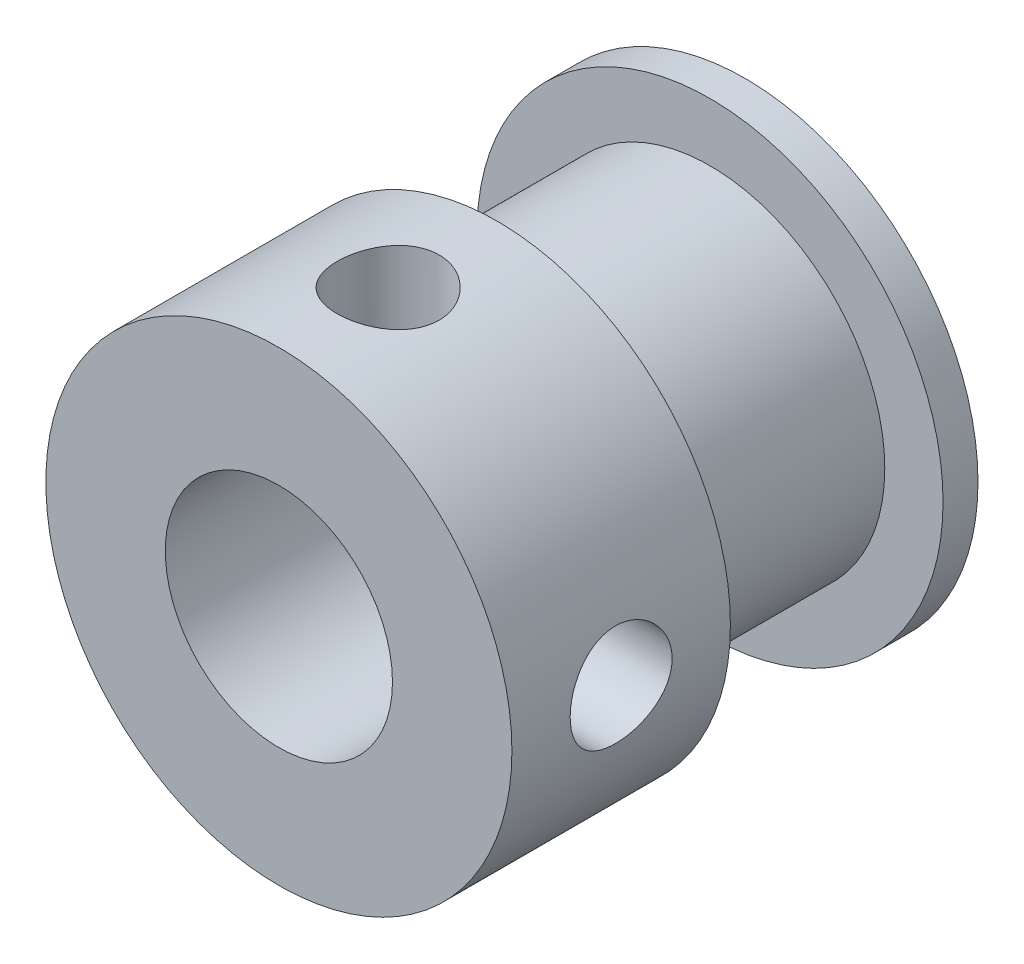
ISO-10303-21;
HEADER;
FILE_DESCRIPTION(('STEP AP214'),'2;1');
FILE_NAME('part.step','',(''),(''),'','','');
FILE_SCHEMA(('AUTOMOTIVE_DESIGN { 1 0 10303 214 1 1 1 1 }'));
ENDSEC;
DATA;
#1=APPLICATION_CONTEXT('core data for automotive mechanical design processes');
#2=APPLICATION_PROTOCOL_DEFINITION('international standard','automotive_design',2000,#1);
#3=PRODUCT_CONTEXT('',#1,'mechanical');
#4=PRODUCT('Part','Part','',(#3));
#5=PRODUCT_RELATED_PRODUCT_CATEGORY('part','',(#4));
#6=PRODUCT_DEFINITION_FORMATION('','',#4);
#7=PRODUCT_DEFINITION_CONTEXT('part definition',#1,'design');
#8=PRODUCT_DEFINITION('design','',#6,#7);
#9=PRODUCT_DEFINITION_SHAPE('','',#8);
#10=(LENGTH_UNIT() NAMED_UNIT(*) SI_UNIT(.MILLI.,.METRE.));
#11=(NAMED_UNIT(*) PLANE_ANGLE_UNIT() SI_UNIT($,.RADIAN.));
#12=(NAMED_UNIT(*) SI_UNIT($,.STERADIAN.) SOLID_ANGLE_UNIT());
#13=UNCERTAINTY_MEASURE_WITH_UNIT(LENGTH_MEASURE(1.E-05),#10,'distance_accuracy_value','');
#14=(GEOMETRIC_REPRESENTATION_CONTEXT(3) GLOBAL_UNCERTAINTY_ASSIGNED_CONTEXT((#13)) GLOBAL_UNIT_ASSIGNED_CONTEXT((#10,
#11,#12)) REPRESENTATION_CONTEXT('',''));
#15=CARTESIAN_POINT('',(0.,0.,0.));
#16=DIRECTION('',(0.,0.,1.));
#17=DIRECTION('',(1.,0.,0.));
#18=AXIS2_PLACEMENT_3D('',#15,#16,#17);
#19=CARTESIAN_POINT('',(0.,0.,16.));
#20=DIRECTION('',(0.,0.,-1.));
#21=DIRECTION('',(-1.,0.,0.));
#22=AXIS2_PLACEMENT_3D('',#19,#20,#21);
#23=CYLINDRICAL_SURFACE('',#22,8.);
#24=CARTESIAN_POINT('',(0.,0.,0.));
#25=DIRECTION('',(0.,0.,1.));
#26=DIRECTION('',(1.,0.,0.));
#27=AXIS2_PLACEMENT_3D('',#24,#25,#26);
#28=CIRCLE('',#27,8.);
#29=CARTESIAN_POINT('',(8.,0.,0.));
#30=VERTEX_POINT('',#29);
#31=EDGE_CURVE('E48',#30,#30,#28,.T.);
#32=ORIENTED_EDGE('',*,*,#31,.T.);
#33=EDGE_LOOP('',(#32));
#34=FACE_BOUND('',#33,.T.);
#35=CARTESIAN_POINT('',(0.,0.,1.2));
#36=DIRECTION('',(0.,0.,1.));
#37=DIRECTION('',(1.,0.,0.));
#38=AXIS2_PLACEMENT_3D('',#35,#36,#37);
#39=CIRCLE('',#38,8.);
#40=CARTESIAN_POINT('',(8.,0.,1.2));
#41=VERTEX_POINT('',#40);
#42=EDGE_CURVE('E44',#41,#41,#39,.T.);
#43=ORIENTED_EDGE('',*,*,#42,.F.);
#44=EDGE_LOOP('',(#43));
#45=FACE_BOUND('',#44,.T.);
#46=ADVANCED_FACE('F40',(#34,#45),#23,.T.);
#47=CARTESIAN_POINT('',(0.,0.,16.));
#48=DIRECTION('',(0.,0.,1.));
#49=DIRECTION('',(1.,0.,0.));
#50=AXIS2_PLACEMENT_3D('',#47,#48,#49);
#51=PLANE('',#50);
#52=CARTESIAN_POINT('',(0.,0.,16.));
#53=DIRECTION('',(0.,0.,1.));
#54=DIRECTION('',(1.,0.,0.));
#55=AXIS2_PLACEMENT_3D('',#52,#53,#54);
#56=CIRCLE('',#55,8.);
#57=CARTESIAN_POINT('',(8.,0.,16.));
#58=VERTEX_POINT('',#57);
#59=EDGE_CURVE('E11',#58,#58,#56,.T.);
#60=ORIENTED_EDGE('',*,*,#59,.T.);
#61=EDGE_LOOP('',(#60));
#62=FACE_BOUND('',#61,.T.);
#63=CARTESIAN_POINT('',(0.,0.,16.));
#64=DIRECTION('',(0.,0.,1.));
#65=DIRECTION('',(1.,0.,0.));
#66=AXIS2_PLACEMENT_3D('',#63,#64,#65);
#67=CIRCLE('',#66,3.9);
#68=CARTESIAN_POINT('',(3.9,0.,16.));
#69=VERTEX_POINT('',#68);
#70=EDGE_CURVE('E53',#69,#69,#67,.T.);
#71=ORIENTED_EDGE('',*,*,#70,.F.);
#72=EDGE_LOOP('',(#71));
#73=FACE_BOUND('',#72,.T.);
#74=ADVANCED_FACE('F105',(#62,#73),#51,.T.);
#75=CARTESIAN_POINT('',(0.,0.,0.));
#76=DIRECTION('',(0.,0.,1.));
#77=DIRECTION('',(1.,0.,0.));
#78=AXIS2_PLACEMENT_3D('',#75,#76,#77);
#79=PLANE('',#78);
#80=ORIENTED_EDGE('',*,*,#31,.F.);
#81=EDGE_LOOP('',(#80));
#82=FACE_BOUND('',#81,.T.);
#83=CARTESIAN_POINT('',(0.,0.,0.));
#84=DIRECTION('',(0.,0.,1.));
#85=DIRECTION('',(1.,0.,0.));
#86=AXIS2_PLACEMENT_3D('',#83,#84,#85);
#87=CIRCLE('',#86,3.9);
#88=CARTESIAN_POINT('',(3.9,0.,0.));
#89=VERTEX_POINT('',#88);
#90=EDGE_CURVE('E56',#89,#89,#87,.T.);
#91=ORIENTED_EDGE('',*,*,#90,.T.);
#92=EDGE_LOOP('',(#91));
#93=FACE_BOUND('',#92,.T.);
#94=ADVANCED_FACE('F85',(#82,#93),#79,.F.);
#95=CARTESIAN_POINT('',(0.,8.,14.));
#96=CARTESIAN_POINT('',(0.0970593350151599,7.99999820976199,13.9999966857365));
#97=CARTESIAN_POINT('',(0.194158718935764,7.99821570498197,13.9918980133388));
#98=CARTESIAN_POINT('',(0.385599393425195,7.99127711250709,13.9597509472335));
#99=CARTESIAN_POINT('',(0.479938663088248,7.98611861450843,13.9356911578552));
#100=CARTESIAN_POINT('',(0.663064722809455,7.973002390759,13.8724115117151));
#101=CARTESIAN_POINT('',(0.751857201182269,7.96504759005983,13.83320749224));
#102=CARTESIAN_POINT('',(0.921601058551573,7.94719730036192,13.7408025033185));
#103=CARTESIAN_POINT('',(1.00255264012586,7.9373018615216,13.6876018956207));
#104=CARTESIAN_POINT('',(1.15561917902203,7.91647673705169,13.5678102893751));
#105=CARTESIAN_POINT('',(1.22759027771492,7.90553422192292,13.501037686599));
#106=CARTESIAN_POINT('',(1.3594054745263,7.88393863133685,13.3563873870963));
#107=CARTESIAN_POINT('',(1.41924849117725,7.87328558176462,13.2785087010883));
#108=CARTESIAN_POINT('',(1.52574354875191,7.85334859305538,13.1127932344162));
#109=CARTESIAN_POINT('',(1.57224243577139,7.84408109293136,13.0248558768205));
#110=CARTESIAN_POINT('',(1.64974688983709,7.82814863989337,12.8421791579886));
#111=CARTESIAN_POINT('',(1.68075430981412,7.82148337574742,12.7474406117921));
#112=CARTESIAN_POINT('',(1.72592019766616,7.8116407126826,12.5554113049612));
#113=CARTESIAN_POINT('',(1.74033336961636,7.80841064772011,12.4581832087145));
#114=CARTESIAN_POINT('',(1.75269359259673,7.80564592573969,12.2626394392104));
#115=CARTESIAN_POINT('',(1.75064266801701,7.80611081439809,12.164323901147));
#116=CARTESIAN_POINT('',(1.73033788658275,7.81063579363394,11.9712896648965));
#117=CARTESIAN_POINT('',(1.71237992433051,7.81463022611758,11.8765380699421));
#118=CARTESIAN_POINT('',(1.66123961776057,7.8256604106414,11.6914258870833));
#119=CARTESIAN_POINT('',(1.62805641913031,7.83269633334324,11.601065545894));
#120=CARTESIAN_POINT('',(1.54713590259168,7.84908142575243,11.4264690657102));
#121=CARTESIAN_POINT('',(1.49928481262593,7.85844856683516,11.3422874135788));
#122=CARTESIAN_POINT('',(1.39046682908872,7.87842963219284,11.1830390817802));
#123=CARTESIAN_POINT('',(1.32949814730235,7.88904372636514,11.1079736470379));
#124=CARTESIAN_POINT('',(1.19460937489082,7.91060446260824,10.9673850396078));
#125=CARTESIAN_POINT('',(1.12043767851035,7.92155333191846,10.9021033752664));
#126=CARTESIAN_POINT('',(0.962075236204357,7.94234089245359,10.7848662374023));
#127=CARTESIAN_POINT('',(0.877884308758419,7.95217956355851,10.732911005371));
#128=CARTESIAN_POINT('',(0.701578448800818,7.96967012140718,10.6437418423677));
#129=CARTESIAN_POINT('',(0.609447011102092,7.97731730300528,10.6065595639265));
#130=CARTESIAN_POINT('',(0.420039431240133,7.98952827368579,10.5482711330324));
#131=CARTESIAN_POINT('',(0.322764039566418,7.99409251123072,10.5271626423382));
#132=CARTESIAN_POINT('',(0.127901429629173,7.99955949359536,10.5019722661835));
#133=CARTESIAN_POINT('',(0.0303587923624079,8.00053317276936,10.4975604773187));
#134=CARTESIAN_POINT('',(-0.164069740933708,7.99890811067611,10.504994543501));
#135=CARTESIAN_POINT('',(-0.260955681068859,7.9963096117651,10.5168392956148));
#136=CARTESIAN_POINT('',(-0.450227474165148,7.98787693126455,10.5561766648839));
#137=CARTESIAN_POINT('',(-0.542651027433256,7.98207854907295,10.583496241809));
#138=CARTESIAN_POINT('',(-0.721603760326953,7.96789511342711,10.6528156860869));
#139=CARTESIAN_POINT('',(-0.808132436960157,7.95950983957769,10.6948168043022));
#140=CARTESIAN_POINT('',(-0.97420328371358,7.94090779663354,10.7929944136583));
#141=CARTESIAN_POINT('',(-1.05362808603427,7.93066659115626,10.8493647035378));
#142=CARTESIAN_POINT('',(-1.20200932191072,7.90953858077059,10.9744253113372));
#143=CARTESIAN_POINT('',(-1.2709643934262,7.898651692119,11.0431172296854));
#144=CARTESIAN_POINT('',(-1.39775310506235,7.87721432670249,11.1923850233085));
#145=CARTESIAN_POINT('',(-1.45535830381534,7.86667375069786,11.2731566231091));
#146=CARTESIAN_POINT('',(-1.55618726114744,7.84735161891496,11.4434215786921));
#147=CARTESIAN_POINT('',(-1.5994116419906,7.83856998703299,11.53291455688));
#148=CARTESIAN_POINT('',(-1.66996009440668,7.82384388791895,11.7176020353281));
#149=CARTESIAN_POINT('',(-1.69737356394447,7.81788350386444,11.8127610548625));
#150=CARTESIAN_POINT('',(-1.73578387332271,7.80944608384998,12.0064820046403));
#151=CARTESIAN_POINT('',(-1.74678333897331,7.80696849073849,12.1050433880132));
#152=CARTESIAN_POINT('',(-1.75194163710046,7.80581228747132,12.3004679246802));
#153=CARTESIAN_POINT('',(-1.74646267912392,7.80705196674948,12.3973212096173));
#154=CARTESIAN_POINT('',(-1.7196294204196,7.81300583032519,12.5886886230969));
#155=CARTESIAN_POINT('',(-1.69827530684468,7.81771997366214,12.6832027792018));
#156=CARTESIAN_POINT('',(-1.64047291068329,7.83005176572579,12.8669212316384));
#157=CARTESIAN_POINT('',(-1.60407735181834,7.83765926522136,12.9561428425727));
#158=CARTESIAN_POINT('',(-1.51727048968564,7.85492457749753,13.127267291555));
#159=CARTESIAN_POINT('',(-1.46685772585982,7.86458260391317,13.2091693657496));
#160=CARTESIAN_POINT('',(-1.35224615086081,7.88510483142732,13.3651153484138));
#161=CARTESIAN_POINT('',(-1.28778921304302,7.89598947159458,13.4389668945064));
#162=CARTESIAN_POINT('',(-1.14744205512987,7.91760116007137,13.5749242469263));
#163=CARTESIAN_POINT('',(-1.07154919548321,7.92832817136922,13.6370273340814));
#164=CARTESIAN_POINT('',(-0.909297791240159,7.948581041013,13.7484963348522));
#165=CARTESIAN_POINT('',(-0.822816221637429,7.95808950687132,13.7976865127494));
#166=CARTESIAN_POINT('',(-0.642622783374223,7.97465942662438,13.8807547003765));
#167=CARTESIAN_POINT('',(-0.548917055005222,7.98172293121789,13.9146455496341));
#168=CARTESIAN_POINT('',(-0.37926518196647,7.99134698819861,13.9601140362391));
#169=CARTESIAN_POINT('',(-0.304236707923587,7.99457176616468,13.9750427289055));
#170=CARTESIAN_POINT('',(-0.152813724405272,7.99889892979335,13.9949867958047));
#171=CARTESIAN_POINT('',(-0.0764192756345342,8.00000140953667,14.000002609472));
#172=CARTESIAN_POINT('',(0.,8.,14.));
#173=B_SPLINE_CURVE_WITH_KNOTS('',3,(#95,#96,#97,#98,#99,#100,#101,#102,#103,#104,#105,#106,
#107,#108,#109,#110,#111,#112,#113,#114,#115,#116,#117,#118,#119,#120,#121,#122,#123,#124,#125,
#126,#127,#128,#129,#130,#131,#132,#133,#134,#135,#136,#137,#138,#139,#140,#141,#142,#143,#144,
#145,#146,#147,#148,#149,#150,#151,#152,#153,#154,#155,#156,#157,#158,#159,#160,#161,#162,#163,
#164,#165,#166,#167,#168,#169,#170,#171,#172),.UNSPECIFIED.,.T.,.F.,(4,2,2,2,2,2,2,2,2,2,2,2,2,
2,2,2,2,2,2,2,2,2,2,2,2,2,2,2,2,2,2,2,2,2,2,2,2,2,4),(0.,0.290898279236849,0.582004473362016,
0.872807059744419,1.16360213093151,1.45858009706578,1.7535843549802,2.05185017097239,
2.3500803029129,2.64366919108495,2.93722198074804,3.2254263046949,3.51364680222945,
3.80416202417276,4.0947168748217,4.39155618463579,4.6884008731661,4.9858781948911,
5.28331223455319,5.5748377527744,5.86634349327398,6.15465219015976,6.44298545684156,
6.73543477188155,7.02792210003658,7.3258010778639,7.6236671646654,7.9198321172811,
8.21594968619037,8.50560626091059,8.79525942091184,9.08390577736446,9.37258222133171,
9.66709530846838,9.96167647726522,10.2600801610668,10.5582329503546,10.7872806901088,
11.0163182760262),.UNSPECIFIED.);
#174=CARTESIAN_POINT('',(0.,8.,14.));
#175=VERTEX_POINT('',#174);
#176=EDGE_CURVE('E189',#175,#175,#173,.T.);
#177=ORIENTED_EDGE('',*,*,#176,.F.);
#178=EDGE_LOOP('',(#177));
#179=FACE_BOUND('',#178,.T.);
#180=CARTESIAN_POINT('',(8.,0.,10.5));
#181=CARTESIAN_POINT('',(7.99999820976199,0.0970593350151599,10.5000033142635));
#182=CARTESIAN_POINT('',(7.99821570498197,0.194158718935764,10.5081019866612));
#183=CARTESIAN_POINT('',(7.99127711250709,0.385599393425195,10.5402490527665));
#184=CARTESIAN_POINT('',(7.98611861450843,0.479938663088248,10.5643088421448));
#185=CARTESIAN_POINT('',(7.973002390759,0.663064722809455,10.6275884882849));
#186=CARTESIAN_POINT('',(7.96504759005983,0.751857201182269,10.66679250776));
#187=CARTESIAN_POINT('',(7.94719730036192,0.921601058551573,10.7591974966815));
#188=CARTESIAN_POINT('',(7.9373018615216,1.00255264012586,10.8123981043793));
#189=CARTESIAN_POINT('',(7.91647673705169,1.15561917902203,10.9321897106249));
#190=CARTESIAN_POINT('',(7.90553422192292,1.22759027771492,10.998962313401));
#191=CARTESIAN_POINT('',(7.88393863133685,1.3594054745263,11.1436126129037));
#192=CARTESIAN_POINT('',(7.87328558176462,1.41924849117725,11.2214912989117));
#193=CARTESIAN_POINT('',(7.85334859305538,1.52574354875191,11.3872067655838));
#194=CARTESIAN_POINT('',(7.84408109293136,1.57224243577139,11.4751441231795));
#195=CARTESIAN_POINT('',(7.82814863989337,1.64974688983709,11.6578208420114));
#196=CARTESIAN_POINT('',(7.82148337574742,1.68075430981412,11.7525593882079));
#197=CARTESIAN_POINT('',(7.8116407126826,1.72592019766616,11.9445886950388));
#198=CARTESIAN_POINT('',(7.80841064772011,1.74033336961636,12.0418167912855));
#199=CARTESIAN_POINT('',(7.80564592573969,1.75269359259673,12.2373605607896));
#200=CARTESIAN_POINT('',(7.80611081439809,1.75064266801701,12.335676098853));
#201=CARTESIAN_POINT('',(7.81063579363394,1.73033788658275,12.5287103351035));
#202=CARTESIAN_POINT('',(7.81463022611758,1.71237992433051,12.6234619300579));
#203=CARTESIAN_POINT('',(7.8256604106414,1.66123961776057,12.8085741129167));
#204=CARTESIAN_POINT('',(7.83269633334324,1.62805641913031,12.898934454106));
#205=CARTESIAN_POINT('',(7.84908142575243,1.54713590259168,13.0735309342898));
#206=CARTESIAN_POINT('',(7.85844856683516,1.49928481262593,13.1577125864212));
#207=CARTESIAN_POINT('',(7.87842963219284,1.39046682908872,13.3169609182198));
#208=CARTESIAN_POINT('',(7.88904372636514,1.32949814730235,13.3920263529621));
#209=CARTESIAN_POINT('',(7.91060446260824,1.19460937489082,13.5326149603922));
#210=CARTESIAN_POINT('',(7.92155333191846,1.12043767851035,13.5978966247336));
#211=CARTESIAN_POINT('',(7.94234089245359,0.962075236204358,13.7151337625977));
#212=CARTESIAN_POINT('',(7.95217956355851,0.877884308758419,13.767088994629));
#213=CARTESIAN_POINT('',(7.96967012140718,0.701578448800819,13.8562581576323));
#214=CARTESIAN_POINT('',(7.97731730300528,0.609447011102093,13.8934404360735));
#215=CARTESIAN_POINT('',(7.98952827368579,0.420039431240134,13.9517288669676));
#216=CARTESIAN_POINT('',(7.99409251123072,0.322764039566419,13.9728373576618));
#217=CARTESIAN_POINT('',(7.99955949359536,0.127901429629174,13.9980277338165));
#218=CARTESIAN_POINT('',(8.00053317276936,0.0303587923624086,14.0024395226813));
#219=CARTESIAN_POINT('',(7.99890811067611,-0.164069740933708,13.995005456499));
#220=CARTESIAN_POINT('',(7.9963096117651,-0.260955681068859,13.9831607043852));
#221=CARTESIAN_POINT('',(7.98787693126455,-0.450227474165148,13.9438233351161));
#222=CARTESIAN_POINT('',(7.98207854907295,-0.542651027433256,13.916503758191));
#223=CARTESIAN_POINT('',(7.96789511342711,-0.721603760326954,13.8471843139131));
#224=CARTESIAN_POINT('',(7.95950983957769,-0.808132436960158,13.8051831956978));
#225=CARTESIAN_POINT('',(7.94090779663354,-0.974203283713581,13.7070055863417));
#226=CARTESIAN_POINT('',(7.93066659115626,-1.05362808603427,13.6506352964622));
#227=CARTESIAN_POINT('',(7.90953858077059,-1.20200932191072,13.5255746886628));
#228=CARTESIAN_POINT('',(7.898651692119,-1.2709643934262,13.4568827703146));
#229=CARTESIAN_POINT('',(7.87721432670249,-1.39775310506235,13.3076149766915));
#230=CARTESIAN_POINT('',(7.86667375069786,-1.45535830381534,13.2268433768909));
#231=CARTESIAN_POINT('',(7.84735161891496,-1.55618726114744,13.0565784213079));
#232=CARTESIAN_POINT('',(7.83856998703299,-1.5994116419906,12.96708544312));
#233=CARTESIAN_POINT('',(7.82384388791895,-1.66996009440668,12.7823979646719));
#234=CARTESIAN_POINT('',(7.81788350386444,-1.69737356394447,12.6872389451375));
#235=CARTESIAN_POINT('',(7.80944608384998,-1.73578387332271,12.4935179953597));
#236=CARTESIAN_POINT('',(7.80696849073849,-1.74678333897331,12.3949566119868));
#237=CARTESIAN_POINT('',(7.80581228747132,-1.75194163710046,12.1995320753198));
#238=CARTESIAN_POINT('',(7.80705196674948,-1.74646267912392,12.1026787903827));
#239=CARTESIAN_POINT('',(7.81300583032519,-1.7196294204196,11.9113113769031));
#240=CARTESIAN_POINT('',(7.81771997366214,-1.69827530684468,11.8167972207982));
#241=CARTESIAN_POINT('',(7.83005176572579,-1.64047291068329,11.6330787683617));
#242=CARTESIAN_POINT('',(7.83765926522136,-1.60407735181834,11.5438571574273));
#243=CARTESIAN_POINT('',(7.85492457749753,-1.51727048968564,11.372732708445));
#244=CARTESIAN_POINT('',(7.86458260391317,-1.46685772585982,11.2908306342504));
#245=CARTESIAN_POINT('',(7.88510483142732,-1.35224615086081,11.1348846515862));
#246=CARTESIAN_POINT('',(7.89598947159458,-1.28778921304302,11.0610331054936));
#247=CARTESIAN_POINT('',(7.91760116007137,-1.14744205512987,10.9250757530737));
#248=CARTESIAN_POINT('',(7.92832817136922,-1.07154919548322,10.8629726659186));
#249=CARTESIAN_POINT('',(7.948581041013,-0.909297791240162,10.7515036651478));
#250=CARTESIAN_POINT('',(7.95808950687132,-0.822816221637431,10.7023134872506));
#251=CARTESIAN_POINT('',(7.97465942662438,-0.642622783374224,10.6192452996235));
#252=CARTESIAN_POINT('',(7.98172293121789,-0.548917055005223,10.5853544503659));
#253=CARTESIAN_POINT('',(7.99134698819861,-0.37926518196647,10.5398859637609));
#254=CARTESIAN_POINT('',(7.99457176616468,-0.304236707923587,10.5249572710945));
#255=CARTESIAN_POINT('',(7.99889892979335,-0.152813724405272,10.5050132041953));
#256=CARTESIAN_POINT('',(8.00000140953667,-0.0764192756345343,10.499997390528));
#257=CARTESIAN_POINT('',(8.,0.,10.5));
#258=B_SPLINE_CURVE_WITH_KNOTS('',3,(#180,#181,#182,#183,#184,#185,#186,#187,#188,#189,#190,
#191,#192,#193,#194,#195,#196,#197,#198,#199,#200,#201,#202,#203,#204,#205,#206,#207,#208,#209,
#210,#211,#212,#213,#214,#215,#216,#217,#218,#219,#220,#221,#222,#223,#224,#225,#226,#227,#228,
#229,#230,#231,#232,#233,#234,#235,#236,#237,#238,#239,#240,#241,#242,#243,#244,#245,#246,#247,
#248,#249,#250,#251,#252,#253,#254,#255,#256,#257),.UNSPECIFIED.,.T.,.F.,(4,2,2,2,2,2,2,2,2,2,2,
2,2,2,2,2,2,2,2,2,2,2,2,2,2,2,2,2,2,2,2,2,2,2,2,2,2,2,4),(0.,0.290898279236849,
0.582004473362016,0.872807059744419,1.16360213093151,1.45858009706578,1.7535843549802,
2.05185017097239,2.3500803029129,2.64366919108495,2.93722198074804,3.2254263046949,
3.51364680222945,3.80416202417276,4.0947168748217,4.39155618463579,4.6884008731661,
4.9858781948911,5.28331223455319,5.5748377527744,5.86634349327398,6.15465219015976,
6.44298545684156,6.73543477188155,7.02792210003658,7.32580107786389,7.6236671646654,
7.9198321172811,8.21594968619037,8.50560626091059,8.79525942091184,9.08390577736446,
9.37258222133171,9.66709530846838,9.96167647726522,10.2600801610668,10.5582329503546,
10.7872806901088,11.0163182760262),.UNSPECIFIED.);
#259=CARTESIAN_POINT('',(8.,0.,10.5));
#260=VERTEX_POINT('',#259);
#261=EDGE_CURVE('E198',#260,#260,#258,.T.);
#262=ORIENTED_EDGE('',*,*,#261,.F.);
#263=EDGE_LOOP('',(#262));
#264=FACE_BOUND('',#263,.T.);
#265=CARTESIAN_POINT('',(0.,0.,8.5));
#266=DIRECTION('',(0.,0.,1.));
#267=DIRECTION('',(1.,0.,0.));
#268=AXIS2_PLACEMENT_3D('',#265,#266,#267);
#269=CIRCLE('',#268,8.);
#270=CARTESIAN_POINT('',(8.,0.,8.5));
#271=VERTEX_POINT('',#270);
#272=EDGE_CURVE('E58',#271,#271,#269,.T.);
#273=ORIENTED_EDGE('',*,*,#272,.T.);
#274=EDGE_LOOP('',(#273));
#275=FACE_BOUND('',#274,.T.);
#276=ORIENTED_EDGE('',*,*,#59,.F.);
#277=EDGE_LOOP('',(#276));
#278=FACE_BOUND('',#277,.T.);
#279=ADVANCED_FACE('F42',(#179,#264,#275,#278),#23,.T.);
#280=CARTESIAN_POINT('',(0.,0.,16.));
#281=DIRECTION('',(0.,0.,-1.));
#282=DIRECTION('',(-1.,0.,0.));
#283=AXIS2_PLACEMENT_3D('',#280,#281,#282);
#284=CYLINDRICAL_SURFACE('',#283,3.9);
#285=CARTESIAN_POINT('',(0.,3.9,14.));
#286=CARTESIAN_POINT('',(0.0930929813309904,3.89999629250316,13.9999954936728));
#287=CARTESIAN_POINT('',(0.186328995589505,3.89662965979276,13.9925279908503));
#288=CARTESIAN_POINT('',(0.370113449921512,3.88349707316384,13.9629563382871));
#289=CARTESIAN_POINT('',(0.46065499316352,3.87371596445538,13.9408175249195));
#290=CARTESIAN_POINT('',(0.636101607684774,3.84879172774722,13.8829040466868));
#291=CARTESIAN_POINT('',(0.721025665441232,3.83366788664522,13.8471783943248));
#292=CARTESIAN_POINT('',(0.883579385394602,3.79949938695992,13.7633268102156));
#293=CARTESIAN_POINT('',(0.961210620731742,3.78045557679755,13.715203561184));
#294=CARTESIAN_POINT('',(1.11148525057314,3.73911537473151,13.6050719096537));
#295=CARTESIAN_POINT('',(1.18366523611528,3.71670192046603,13.5424756183532));
#296=CARTESIAN_POINT('',(1.31691278447074,3.67160705891033,13.4064240471208));
#297=CARTESIAN_POINT('',(1.37797359518919,3.64892549765522,13.3329622178521));
#298=CARTESIAN_POINT('',(1.49083845951987,3.60434480459943,13.1720187488394));
#299=CARTESIAN_POINT('',(1.54188165240338,3.58257124453227,13.0839649605557));
#300=CARTESIAN_POINT('',(1.62822682202113,3.54416799863457,12.8994137092635));
#301=CARTESIAN_POINT('',(1.66353815489957,3.52753525723374,12.8029213058801));
#302=CARTESIAN_POINT('',(1.71542902326636,3.50258438345696,12.6095540560308));
#303=CARTESIAN_POINT('',(1.7329060446861,3.49387059786274,12.5129732882962));
#304=CARTESIAN_POINT('',(1.75142042516958,3.48462988827235,12.3178878181148));
#305=CARTESIAN_POINT('',(1.75246909360754,3.4840973322748,12.219384485948));
#306=CARTESIAN_POINT('',(1.73876540640741,3.49095001146684,12.0329068590825));
#307=CARTESIAN_POINT('',(1.72545172303532,3.4976143966403,11.9447946495676));
#308=CARTESIAN_POINT('',(1.68584350991352,3.51687523931275,11.7722207815147));
#309=CARTESIAN_POINT('',(1.65954598820325,3.52947306406666,11.687759969276));
#310=CARTESIAN_POINT('',(1.59419576775241,3.55947360113985,11.5226010303471));
#311=CARTESIAN_POINT('',(1.55486835942042,3.57697842342824,11.4420309971955));
#312=CARTESIAN_POINT('',(1.46477298829659,3.61480620404884,11.2882893319922));
#313=CARTESIAN_POINT('',(1.41400016880219,3.63513035731298,11.2151208598419));
#314=CARTESIAN_POINT('',(1.29653909449843,3.67876126937982,11.0705949888563));
#315=CARTESIAN_POINT('',(1.22876990397998,3.70216358076812,11.0001422160175));
#316=CARTESIAN_POINT('',(1.08218853075663,3.74763313544612,10.8712704990994));
#317=CARTESIAN_POINT('',(1.00337289447851,3.76969995810597,10.8128553326345));
#318=CARTESIAN_POINT('',(0.833810323557388,3.81085173950339,10.7080900519265));
#319=CARTESIAN_POINT('',(0.742771788205178,3.82982460603113,10.6621644925876));
#320=CARTESIAN_POINT('',(0.553190831477068,3.86176046615574,10.5866079070293));
#321=CARTESIAN_POINT('',(0.454653279420517,3.87472732150363,10.5569664081803));
#322=CARTESIAN_POINT('',(0.26038046454424,3.89243287353117,10.5168433443797));
#323=CARTESIAN_POINT('',(0.164942605779765,3.89769019732157,10.5051513296906));
#324=CARTESIAN_POINT('',(-0.0266708295441627,3.90108412458711,10.4975810337741));
#325=CARTESIAN_POINT('',(-0.122846137341212,3.89922320967271,10.5016972413748));
#326=CARTESIAN_POINT('',(-0.307158703931924,3.88891686711044,10.5248135742221));
#327=CARTESIAN_POINT('',(-0.395433819561822,3.88086965104205,10.5429138841614));
#328=CARTESIAN_POINT('',(-0.56756820003957,3.85945509098722,10.5921749563726));
#329=CARTESIAN_POINT('',(-0.651426930526401,3.84608710488055,10.6233372950179));
#330=CARTESIAN_POINT('',(-0.815317560856381,3.81476581629803,10.6988224866219));
#331=CARTESIAN_POINT('',(-0.895148982755945,3.79668269304511,10.7435249307885));
#332=CARTESIAN_POINT('',(-1.04646485072203,3.75779516649914,10.8444078089025));
#333=CARTESIAN_POINT('',(-1.11794562737169,3.73698957535685,10.9005932590871));
#334=CARTESIAN_POINT('',(-1.25671328718328,3.69274985521507,11.0282105342737));
#335=CARTESIAN_POINT('',(-1.32317573159402,3.66924007811884,11.1005147341833));
#336=CARTESIAN_POINT('',(-1.44330807810277,3.623672052733,11.255524600785));
#337=CARTESIAN_POINT('',(-1.49697316059001,3.60161435356696,11.3382341683828));
#338=CARTESIAN_POINT('',(-1.59114879732464,3.56103214559333,11.5144927723612));
#339=CARTESIAN_POINT('',(-1.63129539540292,3.54261020705684,11.6082617580384));
#340=CARTESIAN_POINT('',(-1.69484091403045,3.51265854795868,11.8023267969721));
#341=CARTESIAN_POINT('',(-1.71825663566035,3.5011219151236,11.9026161917012));
#342=CARTESIAN_POINT('',(-1.7458881839355,3.48741890089213,12.0976058576851));
#343=CARTESIAN_POINT('',(-1.75157996790249,3.48453300122721,12.1920466272957));
#344=CARTESIAN_POINT('',(-1.74766772791785,3.48649745074476,12.3805175919456));
#345=CARTESIAN_POINT('',(-1.73806713994605,3.49134606209229,12.4745478744559));
#346=CARTESIAN_POINT('',(-1.70514246646107,3.50753320697646,12.653417454459));
#347=CARTESIAN_POINT('',(-1.68271329780948,3.51844732505183,12.7384639348967));
#348=CARTESIAN_POINT('',(-1.6257239021227,3.54513839980438,12.903570783045));
#349=CARTESIAN_POINT('',(-1.5911601505062,3.56091676917764,12.9836296941147));
#350=CARTESIAN_POINT('',(-1.50833262164429,3.59681692401707,13.14215507521));
#351=CARTESIAN_POINT('',(-1.45932830831592,3.61715338722072,13.2201848921445));
#352=CARTESIAN_POINT('',(-1.34996131782801,3.65937681572114,13.3673715267694));
#353=CARTESIAN_POINT('',(-1.2895937817558,3.68126444178939,13.4365245273796));
#354=CARTESIAN_POINT('',(-1.15280400896787,3.72648353176331,13.570417857172));
#355=CARTESIAN_POINT('',(-1.07542648720406,3.74976796843584,13.634203050147));
#356=CARTESIAN_POINT('',(-0.910258910842642,3.79324558700669,13.7479928999984));
#357=CARTESIAN_POINT('',(-0.822464101947284,3.81343734774793,13.7979912298834));
#358=CARTESIAN_POINT('',(-0.639623933411937,3.84830524175537,13.8819929848206));
#359=CARTESIAN_POINT('',(-0.544662487552126,3.86303599821292,13.9161557191764));
#360=CARTESIAN_POINT('',(-0.349662199642547,3.88552410813377,13.9676562798171));
#361=CARTESIAN_POINT('',(-0.249639760178899,3.89330263377748,13.9850452016374));
#362=CARTESIAN_POINT('',(-0.124148016383258,3.89810340420757,13.9957690288309));
#363=CARTESIAN_POINT('',(-0.0993532560000189,3.89881337107364,13.9973541200172));
#364=CARTESIAN_POINT('',(-0.0497090641552752,3.89976216710674,13.9994702142473));
#365=CARTESIAN_POINT('',(-0.0248596319762722,3.90000099005323,14.0000012033736));
#366=CARTESIAN_POINT('',(0.,3.9,14.));
#367=B_SPLINE_CURVE_WITH_KNOTS('',3,(#285,#286,#287,#288,#289,#290,#291,#292,#293,#294,#295,
#296,#297,#298,#299,#300,#301,#302,#303,#304,#305,#306,#307,#308,#309,#310,#311,#312,#313,#314,
#315,#316,#317,#318,#319,#320,#321,#322,#323,#324,#325,#326,#327,#328,#329,#330,#331,#332,#333,
#334,#335,#336,#337,#338,#339,#340,#341,#342,#343,#344,#345,#346,#347,#348,#349,#350,#351,#352,
#353,#354,#355,#356,#357,#358,#359,#360,#361,#362,#363,#364,#365,#366),.UNSPECIFIED.,.T.,.F.,(4,
2,2,2,2,2,2,2,2,2,2,2,2,2,2,2,2,2,2,2,2,2,2,2,2,2,2,2,2,2,2,2,2,2,2,2,2,2,2,2,4),(0.,
0.279176870814557,0.559015710459928,0.837854503872936,1.11663300997728,1.4097822976153,
1.70310901018206,2.01378045692179,2.32426689186204,2.61821691252779,2.91196456738207,
3.17880310450798,3.4457031599033,3.71863225636252,3.99167738526227,4.29189113883124,
4.59219896180787,4.90170900320027,5.21101975830983,5.49837943703876,5.78563894354679,
6.05581305290884,6.32601977726621,6.60464051985444,6.88338323630241,7.18498115223449,
7.48669247411839,7.7959761404479,8.10494878715823,8.38739154377117,8.66977084843983,
8.93450719943434,9.1993205088067,9.4812337182954,9.76326774880868,10.0706489669004,
10.3781710128109,10.682528333008,10.9859555799739,11.0605062339015,11.1350578721186),.UNSPECIFIED.);
#368=CARTESIAN_POINT('',(0.,3.9,14.));
#369=VERTEX_POINT('',#368);
#370=EDGE_CURVE('E194',#369,#369,#367,.T.);
#371=ORIENTED_EDGE('',*,*,#370,.T.);
#372=EDGE_LOOP('',(#371));
#373=FACE_BOUND('',#372,.T.);
#374=CARTESIAN_POINT('',(3.9,0.,10.5));
#375=CARTESIAN_POINT('',(3.89999629250316,0.0930929813309905,10.5000045063272));
#376=CARTESIAN_POINT('',(3.89662965979276,0.186328995589505,10.5074720091497));
#377=CARTESIAN_POINT('',(3.88349707316384,0.370113449921512,10.5370436617129));
#378=CARTESIAN_POINT('',(3.87371596445538,0.46065499316352,10.5591824750805));
#379=CARTESIAN_POINT('',(3.84879172774722,0.636101607684775,10.6170959533132));
#380=CARTESIAN_POINT('',(3.83366788664522,0.721025665441233,10.6528216056752));
#381=CARTESIAN_POINT('',(3.79949938695992,0.883579385394602,10.7366731897844));
#382=CARTESIAN_POINT('',(3.78045557679755,0.961210620731742,10.784796438816));
#383=CARTESIAN_POINT('',(3.73911537473151,1.11148525057315,10.8949280903463));
#384=CARTESIAN_POINT('',(3.71670192046603,1.18366523611529,10.9575243816468));
#385=CARTESIAN_POINT('',(3.67160705891033,1.31691278447074,11.0935759528792));
#386=CARTESIAN_POINT('',(3.64892549765522,1.37797359518919,11.1670377821479));
#387=CARTESIAN_POINT('',(3.60434480459943,1.49083845951987,11.3279812511606));
#388=CARTESIAN_POINT('',(3.58257124453227,1.54188165240338,11.4160350394443));
#389=CARTESIAN_POINT('',(3.54416799863457,1.62822682202113,11.6005862907365));
#390=CARTESIAN_POINT('',(3.52753525723374,1.66353815489957,11.6970786941199));
#391=CARTESIAN_POINT('',(3.50258438345696,1.71542902326636,11.8904459439692));
#392=CARTESIAN_POINT('',(3.49387059786274,1.73290604468611,11.9870267117038));
#393=CARTESIAN_POINT('',(3.48462988827235,1.75142042516958,12.1821121818852));
#394=CARTESIAN_POINT('',(3.4840973322748,1.75246909360754,12.280615514052));
#395=CARTESIAN_POINT('',(3.49095001146684,1.73876540640741,12.4670931409175));
#396=CARTESIAN_POINT('',(3.4976143966403,1.72545172303532,12.5552053504324));
#397=CARTESIAN_POINT('',(3.51687523931275,1.68584350991352,12.7277792184853));
#398=CARTESIAN_POINT('',(3.52947306406666,1.65954598820325,12.812240030724));
#399=CARTESIAN_POINT('',(3.55947360113985,1.59419576775241,12.9773989696529));
#400=CARTESIAN_POINT('',(3.57697842342824,1.55486835942042,13.0579690028045));
#401=CARTESIAN_POINT('',(3.61480620404884,1.46477298829659,13.2117106680078));
#402=CARTESIAN_POINT('',(3.63513035731298,1.41400016880219,13.2848791401581));
#403=CARTESIAN_POINT('',(3.67876126937982,1.29653909449843,13.4294050111437));
#404=CARTESIAN_POINT('',(3.70216358076812,1.22876990397998,13.4998577839825));
#405=CARTESIAN_POINT('',(3.74763313544612,1.08218853075663,13.6287295009006));
#406=CARTESIAN_POINT('',(3.76969995810597,1.00337289447851,13.6871446673655));
#407=CARTESIAN_POINT('',(3.81085173950339,0.833810323557388,13.7919099480735));
#408=CARTESIAN_POINT('',(3.82982460603113,0.742771788205178,13.8378355074124));
#409=CARTESIAN_POINT('',(3.86176046615574,0.553190831477069,13.9133920929707));
#410=CARTESIAN_POINT('',(3.87472732150363,0.454653279420518,13.9430335918197));
#411=CARTESIAN_POINT('',(3.89243287353117,0.260380464544242,13.9831566556203));
#412=CARTESIAN_POINT('',(3.89769019732157,0.164942605779767,13.9948486703094));
#413=CARTESIAN_POINT('',(3.90108412458711,-0.0266708295441614,14.002418966226));
#414=CARTESIAN_POINT('',(3.89922320967271,-0.122846137341211,13.9983027586252));
#415=CARTESIAN_POINT('',(3.88891686711044,-0.307158703931923,13.9751864257779));
#416=CARTESIAN_POINT('',(3.88086965104205,-0.395433819561822,13.9570861158386));
#417=CARTESIAN_POINT('',(3.85945509098722,-0.56756820003957,13.9078250436274));
#418=CARTESIAN_POINT('',(3.84608710488055,-0.651426930526401,13.8766627049821));
#419=CARTESIAN_POINT('',(3.81476581629803,-0.815317560856381,13.8011775133781));
#420=CARTESIAN_POINT('',(3.79668269304511,-0.895148982755945,13.7564750692115));
#421=CARTESIAN_POINT('',(3.75779516649914,-1.04646485072203,13.6555921910975));
#422=CARTESIAN_POINT('',(3.73698957535685,-1.11794562737169,13.5994067409129));
#423=CARTESIAN_POINT('',(3.69274985521507,-1.25671328718328,13.4717894657263));
#424=CARTESIAN_POINT('',(3.66924007811884,-1.32317573159402,13.3994852658167));
#425=CARTESIAN_POINT('',(3.623672052733,-1.44330807810277,13.244475399215));
#426=CARTESIAN_POINT('',(3.60161435356696,-1.49697316059001,13.1617658316172));
#427=CARTESIAN_POINT('',(3.56103214559333,-1.59114879732464,12.9855072276388));
#428=CARTESIAN_POINT('',(3.54261020705684,-1.63129539540292,12.8917382419616));
#429=CARTESIAN_POINT('',(3.51265854795868,-1.69484091403045,12.6976732030279));
#430=CARTESIAN_POINT('',(3.5011219151236,-1.71825663566035,12.5973838082988));
#431=CARTESIAN_POINT('',(3.48741890089213,-1.7458881839355,12.4023941423149));
#432=CARTESIAN_POINT('',(3.48453300122721,-1.75157996790249,12.3079533727043));
#433=CARTESIAN_POINT('',(3.48649745074476,-1.74766772791785,12.1194824080544));
#434=CARTESIAN_POINT('',(3.49134606209229,-1.73806713994605,12.0254521255441));
#435=CARTESIAN_POINT('',(3.50753320697646,-1.70514246646107,11.846582545541));
#436=CARTESIAN_POINT('',(3.51844732505183,-1.68271329780948,11.7615360651033));
#437=CARTESIAN_POINT('',(3.54513839980438,-1.6257239021227,11.596429216955));
#438=CARTESIAN_POINT('',(3.56091676917764,-1.5911601505062,11.5163703058853));
#439=CARTESIAN_POINT('',(3.59681692401707,-1.50833262164429,11.35784492479));
#440=CARTESIAN_POINT('',(3.61715338722072,-1.45932830831592,11.2798151078555));
#441=CARTESIAN_POINT('',(3.65937681572114,-1.34996131782801,11.1326284732306));
#442=CARTESIAN_POINT('',(3.68126444178939,-1.2895937817558,11.0634754726204));
#443=CARTESIAN_POINT('',(3.72648353176331,-1.15280400896787,10.929582142828));
#444=CARTESIAN_POINT('',(3.74976796843584,-1.07542648720407,10.865796949853));
#445=CARTESIAN_POINT('',(3.79324558700669,-0.910258910842643,10.7520071000016));
#446=CARTESIAN_POINT('',(3.81343734774793,-0.822464101947284,10.7020087701166));
#447=CARTESIAN_POINT('',(3.84830524175537,-0.639623933411936,10.6180070151794));
#448=CARTESIAN_POINT('',(3.86303599821292,-0.544662487552125,10.5838442808236));
#449=CARTESIAN_POINT('',(3.88552410813377,-0.349662199642546,10.5323437201829));
#450=CARTESIAN_POINT('',(3.89330263377748,-0.249639760178899,10.5149547983626));
#451=CARTESIAN_POINT('',(3.89810340420757,-0.124148016383258,10.5042309711691));
#452=CARTESIAN_POINT('',(3.89881337107364,-0.09935325600002,10.5026458799828));
#453=CARTESIAN_POINT('',(3.89976216710674,-0.0497090641552762,10.5005297857527));
#454=CARTESIAN_POINT('',(3.90000099005323,-0.0248596319762727,10.4999987966264));
#455=CARTESIAN_POINT('',(3.9,0.,10.5));
#456=B_SPLINE_CURVE_WITH_KNOTS('',3,(#374,#375,#376,#377,#378,#379,#380,#381,#382,#383,#384,
#385,#386,#387,#388,#389,#390,#391,#392,#393,#394,#395,#396,#397,#398,#399,#400,#401,#402,#403,
#404,#405,#406,#407,#408,#409,#410,#411,#412,#413,#414,#415,#416,#417,#418,#419,#420,#421,#422,
#423,#424,#425,#426,#427,#428,#429,#430,#431,#432,#433,#434,#435,#436,#437,#438,#439,#440,#441,
#442,#443,#444,#445,#446,#447,#448,#449,#450,#451,#452,#453,#454,#455),.UNSPECIFIED.,.T.,.F.,(4,
2,2,2,2,2,2,2,2,2,2,2,2,2,2,2,2,2,2,2,2,2,2,2,2,2,2,2,2,2,2,2,2,2,2,2,2,2,2,2,4),(0.,
0.279176870814557,0.559015710459929,0.837854503872937,1.11663300997728,1.4097822976153,
1.70310901018206,2.01378045692179,2.32426689186204,2.61821691252779,2.91196456738207,
3.17880310450799,3.44570315990331,3.71863225636252,3.99167738526227,4.29189113883124,
4.59219896180787,4.90170900320027,5.21101975830983,5.49837943703876,5.78563894354679,
6.05581305290884,6.32601977726621,6.60464051985444,6.88338323630241,7.18498115223449,
7.48669247411839,7.7959761404479,8.10494878715824,8.38739154377117,8.66977084843983,
8.93450719943434,9.1993205088067,9.4812337182954,9.76326774880867,10.0706489669004,
10.3781710128109,10.682528333008,10.9859555799739,11.0605062339015,11.1350578721186),.UNSPECIFIED.);
#457=CARTESIAN_POINT('',(3.9,0.,10.5));
#458=VERTEX_POINT('',#457);
#459=EDGE_CURVE('E70',#458,#458,#456,.T.);
#460=ORIENTED_EDGE('',*,*,#459,.T.);
#461=EDGE_LOOP('',(#460));
#462=FACE_BOUND('',#461,.T.);
#463=ORIENTED_EDGE('',*,*,#70,.T.);
#464=EDGE_LOOP('',(#463));
#465=FACE_BOUND('',#464,.T.);
#466=ORIENTED_EDGE('',*,*,#90,.F.);
#467=EDGE_LOOP('',(#466));
#468=FACE_BOUND('',#467,.T.);
#469=ADVANCED_FACE('F87',(#373,#462,#465,#468),#284,.F.);
#470=CARTESIAN_POINT('',(0.,0.,1.2));
#471=DIRECTION('',(0.,0.,1.));
#472=DIRECTION('',(1.,0.,0.));
#473=AXIS2_PLACEMENT_3D('',#470,#471,#472);
#474=PLANE('',#473);
#475=CARTESIAN_POINT('',(0.,0.,1.2));
#476=DIRECTION('',(0.,0.,1.));
#477=DIRECTION('',(1.,0.,0.));
#478=AXIS2_PLACEMENT_3D('',#475,#476,#477);
#479=CIRCLE('',#478,6.);
#480=CARTESIAN_POINT('',(-6.,0.,1.2));
#481=VERTEX_POINT('',#480);
#482=EDGE_CURVE('E60',#481,#481,#479,.T.);
#483=ORIENTED_EDGE('',*,*,#482,.F.);
#484=EDGE_LOOP('',(#483));
#485=FACE_BOUND('',#484,.T.);
#486=ORIENTED_EDGE('',*,*,#42,.T.);
#487=EDGE_LOOP('',(#486));
#488=FACE_BOUND('',#487,.T.);
#489=ADVANCED_FACE('F89',(#485,#488),#474,.T.);
#490=CARTESIAN_POINT('',(0.,0.,8.5));
#491=DIRECTION('',(0.,0.,1.));
#492=DIRECTION('',(1.,0.,0.));
#493=AXIS2_PLACEMENT_3D('',#490,#491,#492);
#494=PLANE('',#493);
#495=CARTESIAN_POINT('',(0.,0.,8.5));
#496=DIRECTION('',(0.,0.,1.));
#497=DIRECTION('',(1.,0.,0.));
#498=AXIS2_PLACEMENT_3D('',#495,#496,#497);
#499=CIRCLE('',#498,6.);
#500=CARTESIAN_POINT('',(-6.,0.,8.5));
#501=VERTEX_POINT('',#500);
#502=EDGE_CURVE('E65',#501,#501,#499,.T.);
#503=ORIENTED_EDGE('',*,*,#502,.T.);
#504=EDGE_LOOP('',(#503));
#505=FACE_BOUND('',#504,.T.);
#506=ORIENTED_EDGE('',*,*,#272,.F.);
#507=EDGE_LOOP('',(#506));
#508=FACE_BOUND('',#507,.T.);
#509=ADVANCED_FACE('F97',(#505,#508),#494,.F.);
#510=CARTESIAN_POINT('',(0.,0.,31.3536911679492));
#511=DIRECTION('',(0.,0.,-1.));
#512=DIRECTION('',(-1.,0.,0.));
#513=AXIS2_PLACEMENT_3D('',#510,#511,#512);
#514=CYLINDRICAL_SURFACE('',#513,6.);
#515=CARTESIAN_POINT('',(-6.,0.,1.2));
#516=CARTESIAN_POINT('',(-6.,0.,1.27604166666667));
#517=CARTESIAN_POINT('',(-6.,0.,1.35208333333334));
#518=CARTESIAN_POINT('',(-6.,0.,1.50416666666667));
#519=CARTESIAN_POINT('',(-6.,0.,1.58020833333334));
#520=CARTESIAN_POINT('',(-6.,0.,1.73229166666667));
#521=CARTESIAN_POINT('',(-6.,0.,1.80833333333334));
#522=CARTESIAN_POINT('',(-6.,0.,1.96041666666667));
#523=CARTESIAN_POINT('',(-6.,0.,2.03645833333334));
#524=CARTESIAN_POINT('',(-6.,0.,2.18854166666667));
#525=CARTESIAN_POINT('',(-6.,0.,2.26458333333334));
#526=CARTESIAN_POINT('',(-6.,0.,2.41666666666667));
#527=CARTESIAN_POINT('',(-6.,0.,2.49270833333334));
#528=CARTESIAN_POINT('',(-6.,0.,2.64479166666667));
#529=CARTESIAN_POINT('',(-6.,0.,2.72083333333333));
#530=CARTESIAN_POINT('',(-6.,0.,2.87291666666667));
#531=CARTESIAN_POINT('',(-6.,0.,2.94895833333334));
#532=CARTESIAN_POINT('',(-6.,0.,3.10104166666667));
#533=CARTESIAN_POINT('',(-6.,0.,3.17708333333334));
#534=CARTESIAN_POINT('',(-6.,0.,3.32916666666667));
#535=CARTESIAN_POINT('',(-6.,0.,3.40520833333334));
#536=CARTESIAN_POINT('',(-6.,0.,3.55729166666667));
#537=CARTESIAN_POINT('',(-6.,0.,3.63333333333333));
#538=CARTESIAN_POINT('',(-6.,0.,3.78541666666667));
#539=CARTESIAN_POINT('',(-6.,0.,3.86145833333333));
#540=CARTESIAN_POINT('',(-6.,0.,4.01354166666667));
#541=CARTESIAN_POINT('',(-6.,0.,4.08958333333333));
#542=CARTESIAN_POINT('',(-6.,0.,4.24166666666667));
#543=CARTESIAN_POINT('',(-6.,0.,4.31770833333334));
#544=CARTESIAN_POINT('',(-6.,0.,4.46979166666667));
#545=CARTESIAN_POINT('',(-6.,0.,4.54583333333334));
#546=CARTESIAN_POINT('',(-6.,0.,4.69791666666667));
#547=CARTESIAN_POINT('',(-6.,0.,4.77395833333333));
#548=CARTESIAN_POINT('',(-6.,0.,4.92604166666667));
#549=CARTESIAN_POINT('',(-6.,0.,5.00208333333333));
#550=CARTESIAN_POINT('',(-6.,0.,5.15416666666667));
#551=CARTESIAN_POINT('',(-6.,0.,5.23020833333333));
#552=CARTESIAN_POINT('',(-6.,0.,5.38229166666667));
#553=CARTESIAN_POINT('',(-6.,0.,5.45833333333333));
#554=CARTESIAN_POINT('',(-6.,0.,5.61041666666667));
#555=CARTESIAN_POINT('',(-6.,0.,5.68645833333333));
#556=CARTESIAN_POINT('',(-6.,0.,5.83854166666667));
#557=CARTESIAN_POINT('',(-6.,0.,5.91458333333333));
#558=CARTESIAN_POINT('',(-6.,0.,6.06666666666667));
#559=CARTESIAN_POINT('',(-6.,0.,6.14270833333333));
#560=CARTESIAN_POINT('',(-6.,0.,6.29479166666667));
#561=CARTESIAN_POINT('',(-6.,0.,6.37083333333333));
#562=CARTESIAN_POINT('',(-6.,0.,6.52291666666666));
#563=CARTESIAN_POINT('',(-6.,0.,6.59895833333333));
#564=CARTESIAN_POINT('',(-6.,0.,6.75104166666666));
#565=CARTESIAN_POINT('',(-6.,0.,6.82708333333333));
#566=CARTESIAN_POINT('',(-6.,0.,6.97916666666667));
#567=CARTESIAN_POINT('',(-6.,0.,7.05520833333333));
#568=CARTESIAN_POINT('',(-6.,0.,7.20729166666666));
#569=CARTESIAN_POINT('',(-6.,0.,7.28333333333333));
#570=CARTESIAN_POINT('',(-6.,0.,7.43541666666666));
#571=CARTESIAN_POINT('',(-6.,0.,7.51145833333333));
#572=CARTESIAN_POINT('',(-6.,0.,7.66354166666666));
#573=CARTESIAN_POINT('',(-6.,0.,7.73958333333333));
#574=CARTESIAN_POINT('',(-6.,0.,7.89166666666666));
#575=CARTESIAN_POINT('',(-6.,0.,7.96770833333333));
#576=CARTESIAN_POINT('',(-6.,0.,8.11979166666667));
#577=CARTESIAN_POINT('',(-6.,0.,8.19583333333333));
#578=CARTESIAN_POINT('',(-6.,0.,8.34791666666666));
#579=CARTESIAN_POINT('',(-6.,0.,8.42395833333333));
#580=CARTESIAN_POINT('',(-6.,0.,8.5));
#581=B_SPLINE_CURVE_WITH_KNOTS('',3,(#515,#516,#517,#518,#519,#520,#521,#522,#523,#524,#525,
#526,#527,#528,#529,#530,#531,#532,#533,#534,#535,#536,#537,#538,#539,#540,#541,#542,#543,#544,
#545,#546,#547,#548,#549,#550,#551,#552,#553,#554,#555,#556,#557,#558,#559,#560,#561,#562,#563,
#564,#565,#566,#567,#568,#569,#570,#571,#572,#573,#574,#575,#576,#577,#578,#579,#580),
.UNSPECIFIED.,.F.,.F.,(4,2,2,2,2,2,2,2,2,2,2,2,2,2,2,2,2,2,2,2,2,2,2,2,2,2,2,2,2,2,2,2,4),(0.,
0.228124999999999,0.456249999999998,0.684375000000001,0.9125,1.140625,1.36875,1.596875,1.825,
2.053125,2.28125,2.509375,2.7375,2.965625,3.19375,3.421875,3.65,3.878125,4.10625,
4.33437499999999,4.5625,4.790625,5.01875,5.24687499999999,5.47499999999999,5.703125,5.93125,
6.15937499999999,6.38749999999999,6.61562499999999,6.84375,7.071875,7.29999999999999),.UNSPECIFIED.);
#582=EDGE_CURVE('BSEAM151',#481,#501,#581,.T.);
#583=ORIENTED_EDGE('',*,*,#482,.T.);
#584=ORIENTED_EDGE('',*,*,#502,.F.);
#585=ORIENTED_EDGE('',*,*,#582,.T.);
#586=ORIENTED_EDGE('',*,*,#582,.F.);
#587=EDGE_LOOP('',(#583,#585,#584,#586));
#588=FACE_BOUND('',#587,.T.);
#589=ADVANCED_FACE('F151',(#588),#514,.T.);
#590=CARTESIAN_POINT('',(-8.001,0.,12.25));
#591=DIRECTION('',(1.,0.,0.));
#592=DIRECTION('',(0.,0.,-1.));
#593=AXIS2_PLACEMENT_3D('',#590,#591,#592);
#594=CYLINDRICAL_SURFACE('',#593,1.75);
#595=ORIENTED_EDGE('',*,*,#459,.F.);
#596=EDGE_LOOP('',(#595));
#597=FACE_BOUND('',#596,.T.);
#598=ORIENTED_EDGE('',*,*,#261,.T.);
#599=EDGE_LOOP('',(#598));
#600=FACE_BOUND('',#599,.T.);
#601=ADVANCED_FACE('F160',(#597,#600),#594,.F.);
#602=CARTESIAN_POINT('',(0.,-8.001,12.25));
#603=DIRECTION('',(0.,1.,0.));
#604=DIRECTION('',(0.,0.,1.));
#605=AXIS2_PLACEMENT_3D('',#602,#603,#604);
#606=CYLINDRICAL_SURFACE('',#605,1.75);
#607=ORIENTED_EDGE('',*,*,#370,.F.);
#608=EDGE_LOOP('',(#607));
#609=FACE_BOUND('',#608,.T.);
#610=ORIENTED_EDGE('',*,*,#176,.T.);
#611=EDGE_LOOP('',(#610));
#612=FACE_BOUND('',#611,.T.);
#613=ADVANCED_FACE('F168',(#609,#612),#606,.F.);
#614=CLOSED_SHELL('',(#46,#74,#94,#279,#469,#489,#509,#589,#601,#613));
#615=MANIFOLD_SOLID_BREP('B2',#614);
#616=ADVANCED_BREP_SHAPE_REPRESENTATION('',(#18,#615),#14);
#617=SHAPE_DEFINITION_REPRESENTATION(#9,#616);
ENDSEC;
END-ISO-10303-21;
